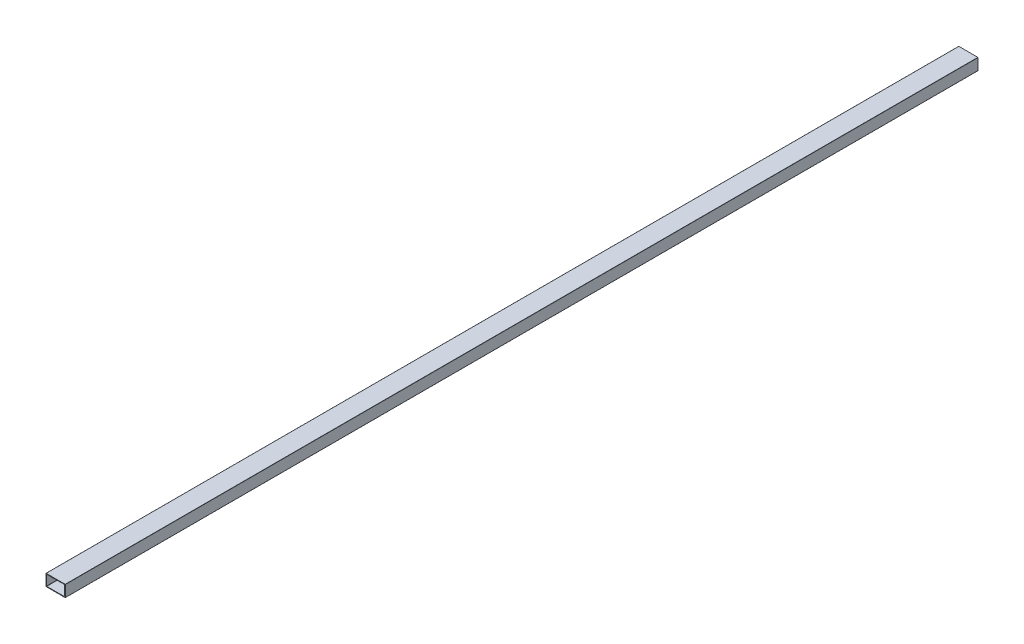
ISO-10303-21;
HEADER;
FILE_DESCRIPTION(('STEP AP214'),'2;1');
FILE_NAME('part.step','',(''),(''),'','','');
FILE_SCHEMA(('AUTOMOTIVE_DESIGN { 1 0 10303 214 1 1 1 1 }'));
ENDSEC;
DATA;
#1=APPLICATION_CONTEXT('core data for automotive mechanical design processes');
#2=APPLICATION_PROTOCOL_DEFINITION('international standard','automotive_design',2000,#1);
#3=PRODUCT_CONTEXT('',#1,'mechanical');
#4=PRODUCT('Part','Part','',(#3));
#5=PRODUCT_RELATED_PRODUCT_CATEGORY('part','',(#4));
#6=PRODUCT_DEFINITION_FORMATION('','',#4);
#7=PRODUCT_DEFINITION_CONTEXT('part definition',#1,'design');
#8=PRODUCT_DEFINITION('design','',#6,#7);
#9=PRODUCT_DEFINITION_SHAPE('','',#8);
#10=(LENGTH_UNIT() NAMED_UNIT(*) SI_UNIT(.MILLI.,.METRE.));
#11=(NAMED_UNIT(*) PLANE_ANGLE_UNIT() SI_UNIT($,.RADIAN.));
#12=(NAMED_UNIT(*) SI_UNIT($,.STERADIAN.) SOLID_ANGLE_UNIT());
#13=UNCERTAINTY_MEASURE_WITH_UNIT(LENGTH_MEASURE(1.E-05),#10,'distance_accuracy_value','');
#14=(GEOMETRIC_REPRESENTATION_CONTEXT(3) GLOBAL_UNCERTAINTY_ASSIGNED_CONTEXT((#13)) GLOBAL_UNIT_ASSIGNED_CONTEXT((#10,
#11,#12)) REPRESENTATION_CONTEXT('',''));
#15=CARTESIAN_POINT('',(0.,0.,0.));
#16=DIRECTION('',(0.,0.,1.));
#17=DIRECTION('',(1.,0.,0.));
#18=AXIS2_PLACEMENT_3D('',#15,#16,#17);
#19=CARTESIAN_POINT('',(63.5,-38.1,-6000.));
#20=DIRECTION('',(1.,0.,0.));
#21=DIRECTION('',(0.,0.,-1.));
#22=AXIS2_PLACEMENT_3D('',#19,#20,#21);
#23=PLANE('',#22);
#24=DIRECTION('',(0.,1.,0.));
#25=VECTOR('',#24,1.);
#26=CARTESIAN_POINT('',(63.5,-38.1,0.));
#27=LINE('',#26,#25);
#28=CARTESIAN_POINT('',(63.5,-37.1,0.));
#29=VERTEX_POINT('',#28);
#30=CARTESIAN_POINT('',(63.5,37.1,0.));
#31=VERTEX_POINT('',#30);
#32=EDGE_CURVE('E197',#29,#31,#27,.T.);
#33=ORIENTED_EDGE('',*,*,#32,.F.);
#34=DIRECTION('',(0.,0.,1.));
#35=VECTOR('',#34,1.);
#36=CARTESIAN_POINT('',(63.5,-37.1,-6000.));
#37=LINE('',#36,#35);
#38=CARTESIAN_POINT('',(63.5,-37.1,-6000.));
#39=VERTEX_POINT('',#38);
#40=EDGE_CURVE('E158',#29,#39,#37,.F.);
#41=ORIENTED_EDGE('',*,*,#40,.T.);
#42=DIRECTION('',(0.,1.,0.));
#43=VECTOR('',#42,1.);
#44=CARTESIAN_POINT('',(63.5,-38.1,-6000.));
#45=LINE('',#44,#43);
#46=CARTESIAN_POINT('',(63.5,37.1,-6000.));
#47=VERTEX_POINT('',#46);
#48=EDGE_CURVE('E185',#39,#47,#45,.T.);
#49=ORIENTED_EDGE('',*,*,#48,.T.);
#50=DIRECTION('',(0.,0.,1.));
#51=VECTOR('',#50,1.);
#52=CARTESIAN_POINT('',(63.5,37.1,-6000.));
#53=LINE('',#52,#51);
#54=EDGE_CURVE('E251',#47,#31,#53,.T.);
#55=ORIENTED_EDGE('',*,*,#54,.T.);
#56=EDGE_LOOP('',(#33,#41,#49,#55));
#57=FACE_BOUND('',#56,.T.);
#58=ADVANCED_FACE('F33',(#57),#23,.T.);
#59=CARTESIAN_POINT('',(-63.5,-38.1,-6000.));
#60=DIRECTION('',(0.,-1.,0.));
#61=DIRECTION('',(0.,0.,-1.));
#62=AXIS2_PLACEMENT_3D('',#59,#60,#61);
#63=PLANE('',#62);
#64=DIRECTION('',(1.,0.,0.));
#65=VECTOR('',#64,1.);
#66=CARTESIAN_POINT('',(-63.5,-38.1,0.));
#67=LINE('',#66,#65);
#68=CARTESIAN_POINT('',(-62.5,-38.1,0.));
#69=VERTEX_POINT('',#68);
#70=CARTESIAN_POINT('',(62.5,-38.1,0.));
#71=VERTEX_POINT('',#70);
#72=EDGE_CURVE('E189',#69,#71,#67,.T.);
#73=ORIENTED_EDGE('',*,*,#72,.F.);
#74=DIRECTION('',(0.,0.,1.));
#75=VECTOR('',#74,1.);
#76=CARTESIAN_POINT('',(-62.5,-38.1,-6000.));
#77=LINE('',#76,#75);
#78=CARTESIAN_POINT('',(-62.5,-38.1,-6000.));
#79=VERTEX_POINT('',#78);
#80=EDGE_CURVE('E238',#69,#79,#77,.F.);
#81=ORIENTED_EDGE('',*,*,#80,.T.);
#82=DIRECTION('',(1.,0.,0.));
#83=VECTOR('',#82,1.);
#84=CARTESIAN_POINT('',(-63.5,-38.1,-6000.));
#85=LINE('',#84,#83);
#86=CARTESIAN_POINT('',(62.5,-38.1,-6000.));
#87=VERTEX_POINT('',#86);
#88=EDGE_CURVE('E194',#79,#87,#85,.T.);
#89=ORIENTED_EDGE('',*,*,#88,.T.);
#90=DIRECTION('',(0.,0.,1.));
#91=VECTOR('',#90,1.);
#92=CARTESIAN_POINT('',(62.5,-38.1,-6000.));
#93=LINE('',#92,#91);
#94=EDGE_CURVE('E235',#87,#71,#93,.T.);
#95=ORIENTED_EDGE('',*,*,#94,.T.);
#96=EDGE_LOOP('',(#73,#81,#89,#95));
#97=FACE_BOUND('',#96,.T.);
#98=ADVANCED_FACE('F305',(#97),#63,.T.);
#99=CARTESIAN_POINT('',(-63.5,-38.1,-6000.));
#100=DIRECTION('',(-1.,0.,0.));
#101=DIRECTION('',(0.,0.,1.));
#102=AXIS2_PLACEMENT_3D('',#99,#100,#101);
#103=PLANE('',#102);
#104=DIRECTION('',(0.,-1.,0.));
#105=VECTOR('',#104,1.);
#106=CARTESIAN_POINT('',(-63.5,-38.1,-6000.));
#107=LINE('',#106,#105);
#108=CARTESIAN_POINT('',(-63.5,37.1,-6000.));
#109=VERTEX_POINT('',#108);
#110=CARTESIAN_POINT('',(-63.5,-37.1,-6000.));
#111=VERTEX_POINT('',#110);
#112=EDGE_CURVE('E191',#109,#111,#107,.T.);
#113=ORIENTED_EDGE('',*,*,#112,.T.);
#114=DIRECTION('',(0.,0.,1.));
#115=VECTOR('',#114,1.);
#116=CARTESIAN_POINT('',(-63.5,-37.1,-6000.));
#117=LINE('',#116,#115);
#118=CARTESIAN_POINT('',(-63.5,-37.1,0.));
#119=VERTEX_POINT('',#118);
#120=EDGE_CURVE('E224',#111,#119,#117,.T.);
#121=ORIENTED_EDGE('',*,*,#120,.T.);
#122=DIRECTION('',(0.,-1.,0.));
#123=VECTOR('',#122,1.);
#124=CARTESIAN_POINT('',(-63.5,-38.1,0.));
#125=LINE('',#124,#123);
#126=CARTESIAN_POINT('',(-63.5,37.1,0.));
#127=VERTEX_POINT('',#126);
#128=EDGE_CURVE('E203',#127,#119,#125,.T.);
#129=ORIENTED_EDGE('',*,*,#128,.F.);
#130=DIRECTION('',(0.,0.,1.));
#131=VECTOR('',#130,1.);
#132=CARTESIAN_POINT('',(-63.5,37.1,-6000.));
#133=LINE('',#132,#131);
#134=EDGE_CURVE('E222',#127,#109,#133,.F.);
#135=ORIENTED_EDGE('',*,*,#134,.T.);
#136=EDGE_LOOP('',(#113,#121,#129,#135));
#137=FACE_BOUND('',#136,.T.);
#138=ADVANCED_FACE('F311',(#137),#103,.T.);
#139=CARTESIAN_POINT('',(-63.5,38.1,-6000.));
#140=DIRECTION('',(0.,1.,0.));
#141=DIRECTION('',(0.,0.,1.));
#142=AXIS2_PLACEMENT_3D('',#139,#140,#141);
#143=PLANE('',#142);
#144=DIRECTION('',(-1.,0.,0.));
#145=VECTOR('',#144,1.);
#146=CARTESIAN_POINT('',(-63.5,38.1,-6000.));
#147=LINE('',#146,#145);
#148=CARTESIAN_POINT('',(62.5,38.1,-6000.));
#149=VERTEX_POINT('',#148);
#150=CARTESIAN_POINT('',(-62.5,38.1,-6000.));
#151=VERTEX_POINT('',#150);
#152=EDGE_CURVE('E188',#149,#151,#147,.T.);
#153=ORIENTED_EDGE('',*,*,#152,.T.);
#154=DIRECTION('',(0.,0.,1.));
#155=VECTOR('',#154,1.);
#156=CARTESIAN_POINT('',(-62.5,38.1,-6000.));
#157=LINE('',#156,#155);
#158=CARTESIAN_POINT('',(-62.5,38.1,0.));
#159=VERTEX_POINT('',#158);
#160=EDGE_CURVE('E248',#151,#159,#157,.T.);
#161=ORIENTED_EDGE('',*,*,#160,.T.);
#162=DIRECTION('',(-1.,0.,0.));
#163=VECTOR('',#162,1.);
#164=CARTESIAN_POINT('',(-63.5,38.1,0.));
#165=LINE('',#164,#163);
#166=CARTESIAN_POINT('',(62.5,38.1,0.));
#167=VERTEX_POINT('',#166);
#168=EDGE_CURVE('E200',#167,#159,#165,.T.);
#169=ORIENTED_EDGE('',*,*,#168,.F.);
#170=DIRECTION('',(0.,0.,1.));
#171=VECTOR('',#170,1.);
#172=CARTESIAN_POINT('',(62.5,38.1,-6000.));
#173=LINE('',#172,#171);
#174=EDGE_CURVE('E55',#167,#149,#173,.F.);
#175=ORIENTED_EDGE('',*,*,#174,.T.);
#176=EDGE_LOOP('',(#153,#161,#169,#175));
#177=FACE_BOUND('',#176,.T.);
#178=ADVANCED_FACE('F316',(#177),#143,.T.);
#179=CARTESIAN_POINT('',(0.,0.,-6000.));
#180=DIRECTION('',(0.,0.,-1.));
#181=DIRECTION('',(-1.,0.,0.));
#182=AXIS2_PLACEMENT_3D('',#179,#180,#181);
#183=PLANE('',#182);
#184=DIRECTION('',(0.,-1.,0.));
#185=VECTOR('',#184,1.);
#186=CARTESIAN_POINT('',(-59.7,-34.3,-6000.));
#187=LINE('',#186,#185);
#188=CARTESIAN_POINT('',(-59.7,33.3,-6000.));
#189=VERTEX_POINT('',#188);
#190=CARTESIAN_POINT('',(-59.7,-33.3,-6000.));
#191=VERTEX_POINT('',#190);
#192=EDGE_CURVE('E167',#189,#191,#187,.T.);
#193=ORIENTED_EDGE('',*,*,#192,.T.);
#194=CARTESIAN_POINT('',(-58.7,-33.3,-6000.));
#195=DIRECTION('',(0.,0.,-1.));
#196=DIRECTION('',(-1.,0.,0.));
#197=AXIS2_PLACEMENT_3D('',#194,#195,#196);
#198=CIRCLE('',#197,1.);
#199=CARTESIAN_POINT('',(-58.7,-34.3,-6000.));
#200=VERTEX_POINT('',#199);
#201=EDGE_CURVE('E11',#191,#200,#198,.F.);
#202=ORIENTED_EDGE('',*,*,#201,.T.);
#203=DIRECTION('',(1.,0.,0.));
#204=VECTOR('',#203,1.);
#205=CARTESIAN_POINT('',(-59.7,-34.3,-6000.));
#206=LINE('',#205,#204);
#207=CARTESIAN_POINT('',(58.7,-34.3,-6000.));
#208=VERTEX_POINT('',#207);
#209=EDGE_CURVE('E175',#200,#208,#206,.T.);
#210=ORIENTED_EDGE('',*,*,#209,.T.);
#211=CARTESIAN_POINT('',(58.7,-33.3,-6000.));
#212=DIRECTION('',(0.,0.,-1.));
#213=DIRECTION('',(-1.,0.,0.));
#214=AXIS2_PLACEMENT_3D('',#211,#212,#213);
#215=CIRCLE('',#214,1.);
#216=CARTESIAN_POINT('',(59.7,-33.3,-6000.));
#217=VERTEX_POINT('',#216);
#218=EDGE_CURVE('E262',#208,#217,#215,.F.);
#219=ORIENTED_EDGE('',*,*,#218,.T.);
#220=DIRECTION('',(0.,1.,0.));
#221=VECTOR('',#220,1.);
#222=CARTESIAN_POINT('',(59.7,-34.3,-6000.));
#223=LINE('',#222,#221);
#224=CARTESIAN_POINT('',(59.7,33.3,-6000.));
#225=VERTEX_POINT('',#224);
#226=EDGE_CURVE('E179',#217,#225,#223,.T.);
#227=ORIENTED_EDGE('',*,*,#226,.T.);
#228=CARTESIAN_POINT('',(58.7,33.3,-6000.));
#229=DIRECTION('',(0.,0.,-1.));
#230=DIRECTION('',(-1.,0.,0.));
#231=AXIS2_PLACEMENT_3D('',#228,#229,#230);
#232=CIRCLE('',#231,1.);
#233=CARTESIAN_POINT('',(58.7,34.3,-6000.));
#234=VERTEX_POINT('',#233);
#235=EDGE_CURVE('E258',#225,#234,#232,.F.);
#236=ORIENTED_EDGE('',*,*,#235,.T.);
#237=DIRECTION('',(-1.,0.,0.));
#238=VECTOR('',#237,1.);
#239=CARTESIAN_POINT('',(-59.7,34.3,-6000.));
#240=LINE('',#239,#238);
#241=CARTESIAN_POINT('',(-58.7,34.3,-6000.));
#242=VERTEX_POINT('',#241);
#243=EDGE_CURVE('E277',#234,#242,#240,.T.);
#244=ORIENTED_EDGE('',*,*,#243,.T.);
#245=CARTESIAN_POINT('',(-58.7,33.3,-6000.));
#246=DIRECTION('',(0.,0.,-1.));
#247=DIRECTION('',(-1.,0.,0.));
#248=AXIS2_PLACEMENT_3D('',#245,#246,#247);
#249=CIRCLE('',#248,1.);
#250=EDGE_CURVE('E157',#242,#189,#249,.F.);
#251=ORIENTED_EDGE('',*,*,#250,.T.);
#252=EDGE_LOOP('',(#193,#202,#210,#219,#227,#236,#244,#251));
#253=FACE_BOUND('',#252,.T.);
#254=ORIENTED_EDGE('',*,*,#88,.F.);
#255=CARTESIAN_POINT('',(-62.5,-37.1,-6000.));
#256=DIRECTION('',(0.,0.,-1.));
#257=DIRECTION('',(-1.,0.,0.));
#258=AXIS2_PLACEMENT_3D('',#255,#256,#257);
#259=CIRCLE('',#258,1.);
#260=EDGE_CURVE('E245',#79,#111,#259,.T.);
#261=ORIENTED_EDGE('',*,*,#260,.T.);
#262=ORIENTED_EDGE('',*,*,#112,.F.);
#263=CARTESIAN_POINT('',(-62.5,37.1,-6000.));
#264=DIRECTION('',(0.,0.,-1.));
#265=DIRECTION('',(-1.,0.,0.));
#266=AXIS2_PLACEMENT_3D('',#263,#264,#265);
#267=CIRCLE('',#266,1.);
#268=EDGE_CURVE('E48',#109,#151,#267,.T.);
#269=ORIENTED_EDGE('',*,*,#268,.T.);
#270=ORIENTED_EDGE('',*,*,#152,.F.);
#271=CARTESIAN_POINT('',(62.5,37.1,-6000.));
#272=DIRECTION('',(0.,0.,-1.));
#273=DIRECTION('',(-1.,0.,0.));
#274=AXIS2_PLACEMENT_3D('',#271,#272,#273);
#275=CIRCLE('',#274,1.);
#276=EDGE_CURVE('E240',#149,#47,#275,.T.);
#277=ORIENTED_EDGE('',*,*,#276,.T.);
#278=ORIENTED_EDGE('',*,*,#48,.F.);
#279=CARTESIAN_POINT('',(62.5,-37.1,-6000.));
#280=DIRECTION('',(0.,0.,-1.));
#281=DIRECTION('',(-1.,0.,0.));
#282=AXIS2_PLACEMENT_3D('',#279,#280,#281);
#283=CIRCLE('',#282,1.);
#284=EDGE_CURVE('E242',#39,#87,#283,.T.);
#285=ORIENTED_EDGE('',*,*,#284,.T.);
#286=EDGE_LOOP('',(#254,#261,#262,#269,#270,#277,#278,#285));
#287=FACE_BOUND('',#286,.T.);
#288=ADVANCED_FACE('F267',(#253,#287),#183,.T.);
#289=CARTESIAN_POINT('',(0.,0.,0.));
#290=DIRECTION('',(0.,0.,-1.));
#291=DIRECTION('',(-1.,0.,0.));
#292=AXIS2_PLACEMENT_3D('',#289,#290,#291);
#293=PLANE('',#292);
#294=DIRECTION('',(0.,1.,0.));
#295=VECTOR('',#294,1.);
#296=CARTESIAN_POINT('',(59.7,-34.3,0.));
#297=LINE('',#296,#295);
#298=CARTESIAN_POINT('',(59.7,-33.3,0.));
#299=VERTEX_POINT('',#298);
#300=CARTESIAN_POINT('',(59.7,33.3,0.));
#301=VERTEX_POINT('',#300);
#302=EDGE_CURVE('E181',#299,#301,#297,.T.);
#303=ORIENTED_EDGE('',*,*,#302,.F.);
#304=CARTESIAN_POINT('',(58.7,-33.3,0.));
#305=DIRECTION('',(0.,0.,-1.));
#306=DIRECTION('',(-1.,0.,0.));
#307=AXIS2_PLACEMENT_3D('',#304,#305,#306);
#308=CIRCLE('',#307,1.);
#309=CARTESIAN_POINT('',(58.7,-34.3,0.));
#310=VERTEX_POINT('',#309);
#311=EDGE_CURVE('E260',#299,#310,#308,.T.);
#312=ORIENTED_EDGE('',*,*,#311,.T.);
#313=DIRECTION('',(1.,0.,0.));
#314=VECTOR('',#313,1.);
#315=CARTESIAN_POINT('',(-59.7,-34.3,0.));
#316=LINE('',#315,#314);
#317=CARTESIAN_POINT('',(-58.7,-34.3,0.));
#318=VERTEX_POINT('',#317);
#319=EDGE_CURVE('E281',#318,#310,#316,.T.);
#320=ORIENTED_EDGE('',*,*,#319,.F.);
#321=CARTESIAN_POINT('',(-58.7,-33.3,0.));
#322=DIRECTION('',(0.,0.,-1.));
#323=DIRECTION('',(-1.,0.,0.));
#324=AXIS2_PLACEMENT_3D('',#321,#322,#323);
#325=CIRCLE('',#324,1.);
#326=CARTESIAN_POINT('',(-59.7,-33.3,0.));
#327=VERTEX_POINT('',#326);
#328=EDGE_CURVE('E41',#318,#327,#325,.T.);
#329=ORIENTED_EDGE('',*,*,#328,.T.);
#330=DIRECTION('',(0.,-1.,0.));
#331=VECTOR('',#330,1.);
#332=CARTESIAN_POINT('',(-59.7,-34.3,0.));
#333=LINE('',#332,#331);
#334=CARTESIAN_POINT('',(-59.7,33.3,0.));
#335=VERTEX_POINT('',#334);
#336=EDGE_CURVE('E164',#335,#327,#333,.T.);
#337=ORIENTED_EDGE('',*,*,#336,.F.);
#338=CARTESIAN_POINT('',(-58.7,33.3,0.));
#339=DIRECTION('',(0.,0.,-1.));
#340=DIRECTION('',(-1.,0.,0.));
#341=AXIS2_PLACEMENT_3D('',#338,#339,#340);
#342=CIRCLE('',#341,1.);
#343=CARTESIAN_POINT('',(-58.7,34.3,0.));
#344=VERTEX_POINT('',#343);
#345=EDGE_CURVE('E147',#335,#344,#342,.T.);
#346=ORIENTED_EDGE('',*,*,#345,.T.);
#347=DIRECTION('',(-1.,0.,0.));
#348=VECTOR('',#347,1.);
#349=CARTESIAN_POINT('',(-59.7,34.3,0.));
#350=LINE('',#349,#348);
#351=CARTESIAN_POINT('',(58.7,34.3,0.));
#352=VERTEX_POINT('',#351);
#353=EDGE_CURVE('E176',#352,#344,#350,.T.);
#354=ORIENTED_EDGE('',*,*,#353,.F.);
#355=CARTESIAN_POINT('',(58.7,33.3,0.));
#356=DIRECTION('',(0.,0.,-1.));
#357=DIRECTION('',(-1.,0.,0.));
#358=AXIS2_PLACEMENT_3D('',#355,#356,#357);
#359=CIRCLE('',#358,1.);
#360=EDGE_CURVE('E256',#352,#301,#359,.T.);
#361=ORIENTED_EDGE('',*,*,#360,.T.);
#362=EDGE_LOOP('',(#303,#312,#320,#329,#337,#346,#354,#361));
#363=FACE_BOUND('',#362,.T.);
#364=ORIENTED_EDGE('',*,*,#128,.T.);
#365=CARTESIAN_POINT('',(-62.5,-37.1,0.));
#366=DIRECTION('',(0.,0.,-1.));
#367=DIRECTION('',(-1.,0.,0.));
#368=AXIS2_PLACEMENT_3D('',#365,#366,#367);
#369=CIRCLE('',#368,1.);
#370=EDGE_CURVE('E233',#119,#69,#369,.F.);
#371=ORIENTED_EDGE('',*,*,#370,.T.);
#372=ORIENTED_EDGE('',*,*,#72,.T.);
#373=CARTESIAN_POINT('',(62.5,-37.1,0.));
#374=DIRECTION('',(0.,0.,-1.));
#375=DIRECTION('',(-1.,0.,0.));
#376=AXIS2_PLACEMENT_3D('',#373,#374,#375);
#377=CIRCLE('',#376,1.);
#378=EDGE_CURVE('E229',#71,#29,#377,.F.);
#379=ORIENTED_EDGE('',*,*,#378,.T.);
#380=ORIENTED_EDGE('',*,*,#32,.T.);
#381=CARTESIAN_POINT('',(62.5,37.1,0.));
#382=DIRECTION('',(0.,0.,-1.));
#383=DIRECTION('',(-1.,0.,0.));
#384=AXIS2_PLACEMENT_3D('',#381,#382,#383);
#385=CIRCLE('',#384,1.);
#386=EDGE_CURVE('E227',#31,#167,#385,.F.);
#387=ORIENTED_EDGE('',*,*,#386,.T.);
#388=ORIENTED_EDGE('',*,*,#168,.T.);
#389=CARTESIAN_POINT('',(-62.5,37.1,0.));
#390=DIRECTION('',(0.,0.,-1.));
#391=DIRECTION('',(-1.,0.,0.));
#392=AXIS2_PLACEMENT_3D('',#389,#390,#391);
#393=CIRCLE('',#392,1.);
#394=EDGE_CURVE('E231',#159,#127,#393,.F.);
#395=ORIENTED_EDGE('',*,*,#394,.T.);
#396=EDGE_LOOP('',(#364,#371,#372,#379,#380,#387,#388,#395));
#397=FACE_BOUND('',#396,.T.);
#398=ADVANCED_FACE('F172',(#363,#397),#293,.F.);
#399=CARTESIAN_POINT('',(-59.7,-34.3,-6000.));
#400=DIRECTION('',(0.,-1.,0.));
#401=DIRECTION('',(0.,0.,-1.));
#402=AXIS2_PLACEMENT_3D('',#399,#400,#401);
#403=PLANE('',#402);
#404=ORIENTED_EDGE('',*,*,#319,.T.);
#405=DIRECTION('',(0.,0.,1.));
#406=VECTOR('',#405,1.);
#407=CARTESIAN_POINT('',(58.7,-34.3,-6000.));
#408=LINE('',#407,#406);
#409=EDGE_CURVE('E220',#310,#208,#408,.F.);
#410=ORIENTED_EDGE('',*,*,#409,.T.);
#411=ORIENTED_EDGE('',*,*,#209,.F.);
#412=DIRECTION('',(0.,0.,1.));
#413=VECTOR('',#412,1.);
#414=CARTESIAN_POINT('',(-58.7,-34.3,0.));
#415=LINE('',#414,#413);
#416=EDGE_CURVE('E217',#200,#318,#415,.T.);
#417=ORIENTED_EDGE('',*,*,#416,.T.);
#418=EDGE_LOOP('',(#404,#410,#411,#417));
#419=FACE_BOUND('',#418,.T.);
#420=ADVANCED_FACE('F283',(#419),#403,.F.);
#421=CARTESIAN_POINT('',(-59.7,-34.3,-6000.));
#422=DIRECTION('',(-1.,0.,0.));
#423=DIRECTION('',(0.,0.,1.));
#424=AXIS2_PLACEMENT_3D('',#421,#422,#423);
#425=PLANE('',#424);
#426=ORIENTED_EDGE('',*,*,#192,.F.);
#427=DIRECTION('',(0.,0.,1.));
#428=VECTOR('',#427,1.);
#429=CARTESIAN_POINT('',(-59.7,33.3,0.));
#430=LINE('',#429,#428);
#431=EDGE_CURVE('E151',#189,#335,#430,.T.);
#432=ORIENTED_EDGE('',*,*,#431,.T.);
#433=ORIENTED_EDGE('',*,*,#336,.T.);
#434=DIRECTION('',(0.,0.,1.));
#435=VECTOR('',#434,1.);
#436=CARTESIAN_POINT('',(-59.7,-33.3,-6000.));
#437=LINE('',#436,#435);
#438=EDGE_CURVE('E169',#327,#191,#437,.F.);
#439=ORIENTED_EDGE('',*,*,#438,.T.);
#440=EDGE_LOOP('',(#426,#432,#433,#439));
#441=FACE_BOUND('',#440,.T.);
#442=ADVANCED_FACE('F163',(#441),#425,.F.);
#443=CARTESIAN_POINT('',(-59.7,34.3,-6000.));
#444=DIRECTION('',(0.,1.,0.));
#445=DIRECTION('',(0.,0.,1.));
#446=AXIS2_PLACEMENT_3D('',#443,#444,#445);
#447=PLANE('',#446);
#448=ORIENTED_EDGE('',*,*,#353,.T.);
#449=DIRECTION('',(0.,0.,1.));
#450=VECTOR('',#449,1.);
#451=CARTESIAN_POINT('',(-58.7,34.3,-6000.));
#452=LINE('',#451,#450);
#453=EDGE_CURVE('E152',#344,#242,#452,.F.);
#454=ORIENTED_EDGE('',*,*,#453,.T.);
#455=ORIENTED_EDGE('',*,*,#243,.F.);
#456=DIRECTION('',(0.,0.,1.));
#457=VECTOR('',#456,1.);
#458=CARTESIAN_POINT('',(58.7,34.3,0.));
#459=LINE('',#458,#457);
#460=EDGE_CURVE('E168',#234,#352,#459,.T.);
#461=ORIENTED_EDGE('',*,*,#460,.T.);
#462=EDGE_LOOP('',(#448,#454,#455,#461));
#463=FACE_BOUND('',#462,.T.);
#464=ADVANCED_FACE('F292',(#463),#447,.F.);
#465=CARTESIAN_POINT('',(59.7,-34.3,-6000.));
#466=DIRECTION('',(1.,0.,0.));
#467=DIRECTION('',(0.,0.,-1.));
#468=AXIS2_PLACEMENT_3D('',#465,#466,#467);
#469=PLANE('',#468);
#470=ORIENTED_EDGE('',*,*,#302,.T.);
#471=DIRECTION('',(0.,0.,1.));
#472=VECTOR('',#471,1.);
#473=CARTESIAN_POINT('',(59.7,33.3,-6000.));
#474=LINE('',#473,#472);
#475=EDGE_CURVE('E215',#301,#225,#474,.F.);
#476=ORIENTED_EDGE('',*,*,#475,.T.);
#477=ORIENTED_EDGE('',*,*,#226,.F.);
#478=DIRECTION('',(0.,0.,1.));
#479=VECTOR('',#478,1.);
#480=CARTESIAN_POINT('',(59.7,-33.3,0.));
#481=LINE('',#480,#479);
#482=EDGE_CURVE('E212',#217,#299,#481,.T.);
#483=ORIENTED_EDGE('',*,*,#482,.T.);
#484=EDGE_LOOP('',(#470,#476,#477,#483));
#485=FACE_BOUND('',#484,.T.);
#486=ADVANCED_FACE('F275',(#485),#469,.F.);
#487=CARTESIAN_POINT('',(-58.7,33.3,-6000.));
#488=DIRECTION('',(0.,0.,-1.));
#489=DIRECTION('',(-1.,0.,0.));
#490=AXIS2_PLACEMENT_3D('',#487,#488,#489);
#491=CYLINDRICAL_SURFACE('',#490,1.);
#492=ORIENTED_EDGE('',*,*,#250,.F.);
#493=ORIENTED_EDGE('',*,*,#453,.F.);
#494=ORIENTED_EDGE('',*,*,#345,.F.);
#495=ORIENTED_EDGE('',*,*,#431,.F.);
#496=EDGE_LOOP('',(#492,#493,#494,#495));
#497=FACE_BOUND('',#496,.T.);
#498=ADVANCED_FACE('F150',(#497),#491,.F.);
#499=CARTESIAN_POINT('',(58.7,33.3,-6000.));
#500=DIRECTION('',(0.,0.,-1.));
#501=DIRECTION('',(-1.,0.,0.));
#502=AXIS2_PLACEMENT_3D('',#499,#500,#501);
#503=CYLINDRICAL_SURFACE('',#502,1.);
#504=ORIENTED_EDGE('',*,*,#235,.F.);
#505=ORIENTED_EDGE('',*,*,#475,.F.);
#506=ORIENTED_EDGE('',*,*,#360,.F.);
#507=ORIENTED_EDGE('',*,*,#460,.F.);
#508=EDGE_LOOP('',(#504,#505,#506,#507));
#509=FACE_BOUND('',#508,.T.);
#510=ADVANCED_FACE('F294',(#509),#503,.F.);
#511=CARTESIAN_POINT('',(58.7,-33.3,-6000.));
#512=DIRECTION('',(0.,0.,-1.));
#513=DIRECTION('',(-1.,0.,0.));
#514=AXIS2_PLACEMENT_3D('',#511,#512,#513);
#515=CYLINDRICAL_SURFACE('',#514,1.);
#516=ORIENTED_EDGE('',*,*,#218,.F.);
#517=ORIENTED_EDGE('',*,*,#409,.F.);
#518=ORIENTED_EDGE('',*,*,#311,.F.);
#519=ORIENTED_EDGE('',*,*,#482,.F.);
#520=EDGE_LOOP('',(#516,#517,#518,#519));
#521=FACE_BOUND('',#520,.T.);
#522=ADVANCED_FACE('F279',(#521),#515,.F.);
#523=CARTESIAN_POINT('',(-62.5,-37.1,-6000.));
#524=DIRECTION('',(0.,0.,1.));
#525=DIRECTION('',(1.,0.,0.));
#526=AXIS2_PLACEMENT_3D('',#523,#524,#525);
#527=CYLINDRICAL_SURFACE('',#526,1.);
#528=ORIENTED_EDGE('',*,*,#260,.F.);
#529=ORIENTED_EDGE('',*,*,#80,.F.);
#530=ORIENTED_EDGE('',*,*,#370,.F.);
#531=ORIENTED_EDGE('',*,*,#120,.F.);
#532=EDGE_LOOP('',(#528,#529,#530,#531));
#533=FACE_BOUND('',#532,.T.);
#534=ADVANCED_FACE('F301',(#533),#527,.T.);
#535=CARTESIAN_POINT('',(-62.5,37.1,-6000.));
#536=DIRECTION('',(0.,0.,1.));
#537=DIRECTION('',(1.,0.,0.));
#538=AXIS2_PLACEMENT_3D('',#535,#536,#537);
#539=CYLINDRICAL_SURFACE('',#538,1.);
#540=ORIENTED_EDGE('',*,*,#268,.F.);
#541=ORIENTED_EDGE('',*,*,#134,.F.);
#542=ORIENTED_EDGE('',*,*,#394,.F.);
#543=ORIENTED_EDGE('',*,*,#160,.F.);
#544=EDGE_LOOP('',(#540,#541,#542,#543));
#545=FACE_BOUND('',#544,.T.);
#546=ADVANCED_FACE('F368',(#545),#539,.T.);
#547=CARTESIAN_POINT('',(-58.7,-33.3,-6000.));
#548=DIRECTION('',(0.,0.,-1.));
#549=DIRECTION('',(-1.,0.,0.));
#550=AXIS2_PLACEMENT_3D('',#547,#548,#549);
#551=CYLINDRICAL_SURFACE('',#550,1.);
#552=ORIENTED_EDGE('',*,*,#201,.F.);
#553=ORIENTED_EDGE('',*,*,#438,.F.);
#554=ORIENTED_EDGE('',*,*,#328,.F.);
#555=ORIENTED_EDGE('',*,*,#416,.F.);
#556=EDGE_LOOP('',(#552,#553,#554,#555));
#557=FACE_BOUND('',#556,.T.);
#558=ADVANCED_FACE('F378',(#557),#551,.F.);
#559=CARTESIAN_POINT('',(62.5,-37.1,-6000.));
#560=DIRECTION('',(0.,0.,1.));
#561=DIRECTION('',(1.,0.,0.));
#562=AXIS2_PLACEMENT_3D('',#559,#560,#561);
#563=CYLINDRICAL_SURFACE('',#562,1.);
#564=ORIENTED_EDGE('',*,*,#284,.F.);
#565=ORIENTED_EDGE('',*,*,#40,.F.);
#566=ORIENTED_EDGE('',*,*,#378,.F.);
#567=ORIENTED_EDGE('',*,*,#94,.F.);
#568=EDGE_LOOP('',(#564,#565,#566,#567));
#569=FACE_BOUND('',#568,.T.);
#570=ADVANCED_FACE('F388',(#569),#563,.T.);
#571=CARTESIAN_POINT('',(62.5,37.1,-6000.));
#572=DIRECTION('',(0.,0.,1.));
#573=DIRECTION('',(1.,0.,0.));
#574=AXIS2_PLACEMENT_3D('',#571,#572,#573);
#575=CYLINDRICAL_SURFACE('',#574,1.);
#576=ORIENTED_EDGE('',*,*,#276,.F.);
#577=ORIENTED_EDGE('',*,*,#174,.F.);
#578=ORIENTED_EDGE('',*,*,#386,.F.);
#579=ORIENTED_EDGE('',*,*,#54,.F.);
#580=EDGE_LOOP('',(#576,#577,#578,#579));
#581=FACE_BOUND('',#580,.T.);
#582=ADVANCED_FACE('F35',(#581),#575,.T.);
#583=CLOSED_SHELL('',(#58,#98,#138,#178,#288,#398,#420,#442,#464,#486,#498,#510,#522,#534,#546,
#558,#570,#582));
#584=MANIFOLD_SOLID_BREP('B2',#583);
#585=ADVANCED_BREP_SHAPE_REPRESENTATION('',(#18,#584),#14);
#586=SHAPE_DEFINITION_REPRESENTATION(#9,#585);
ENDSEC;
END-ISO-10303-21;
